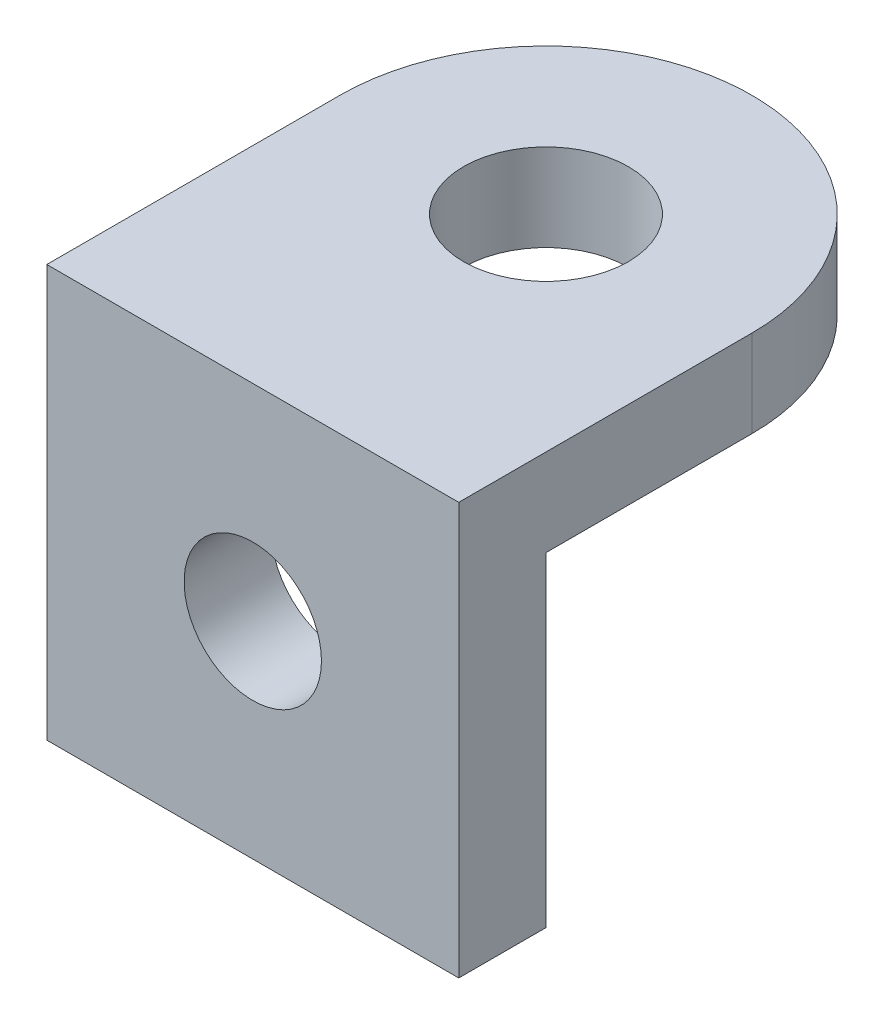
ISO-10303-21;
HEADER;
FILE_DESCRIPTION(('STEP AP214'),'2;1');
FILE_NAME('part.step','',(''),(''),'','','');
FILE_SCHEMA(('AUTOMOTIVE_DESIGN { 1 0 10303 214 1 1 1 1 }'));
ENDSEC;
DATA;
#1=APPLICATION_CONTEXT('core data for automotive mechanical design processes');
#2=APPLICATION_PROTOCOL_DEFINITION('international standard','automotive_design',2000,#1);
#3=PRODUCT_CONTEXT('',#1,'mechanical');
#4=PRODUCT('Part','Part','',(#3));
#5=PRODUCT_RELATED_PRODUCT_CATEGORY('part','',(#4));
#6=PRODUCT_DEFINITION_FORMATION('','',#4);
#7=PRODUCT_DEFINITION_CONTEXT('part definition',#1,'design');
#8=PRODUCT_DEFINITION('design','',#6,#7);
#9=PRODUCT_DEFINITION_SHAPE('','',#8);
#10=(LENGTH_UNIT() NAMED_UNIT(*) SI_UNIT(.MILLI.,.METRE.));
#11=(NAMED_UNIT(*) PLANE_ANGLE_UNIT() SI_UNIT($,.RADIAN.));
#12=(NAMED_UNIT(*) SI_UNIT($,.STERADIAN.) SOLID_ANGLE_UNIT());
#13=UNCERTAINTY_MEASURE_WITH_UNIT(LENGTH_MEASURE(1.E-05),#10,'distance_accuracy_value','');
#14=(GEOMETRIC_REPRESENTATION_CONTEXT(3) GLOBAL_UNCERTAINTY_ASSIGNED_CONTEXT((#13)) GLOBAL_UNIT_ASSIGNED_CONTEXT((#10,
#11,#12)) REPRESENTATION_CONTEXT('',''));
#15=CARTESIAN_POINT('',(0.,0.,0.));
#16=DIRECTION('',(0.,0.,1.));
#17=DIRECTION('',(1.,0.,0.));
#18=AXIS2_PLACEMENT_3D('',#15,#16,#17);
#19=CARTESIAN_POINT('',(0.,0.,3.175));
#20=DIRECTION('',(0.,0.,1.));
#21=DIRECTION('',(1.,0.,0.));
#22=AXIS2_PLACEMENT_3D('',#19,#20,#21);
#23=PLANE('',#22);
#24=DIRECTION('',(0.,1.,0.));
#25=VECTOR('',#24,1.);
#26=CARTESIAN_POINT('',(7.5,0.,3.175));
#27=LINE('',#26,#25);
#28=CARTESIAN_POINT('',(7.5,-15.,3.175));
#29=VERTEX_POINT('',#28);
#30=CARTESIAN_POINT('',(7.5,0.,3.175));
#31=VERTEX_POINT('',#30);
#32=EDGE_CURVE('E131',#29,#31,#27,.T.);
#33=ORIENTED_EDGE('',*,*,#32,.T.);
#34=DIRECTION('',(-1.,0.,0.));
#35=VECTOR('',#34,1.);
#36=CARTESIAN_POINT('',(-7.5,0.,3.175));
#37=LINE('',#36,#35);
#38=CARTESIAN_POINT('',(-7.5,0.,3.175));
#39=VERTEX_POINT('',#38);
#40=EDGE_CURVE('E79',#31,#39,#37,.T.);
#41=ORIENTED_EDGE('',*,*,#40,.T.);
#42=DIRECTION('',(0.,-1.,0.));
#43=VECTOR('',#42,1.);
#44=CARTESIAN_POINT('',(-7.5,0.,3.175));
#45=LINE('',#44,#43);
#46=CARTESIAN_POINT('',(-7.5,-15.,3.175));
#47=VERTEX_POINT('',#46);
#48=EDGE_CURVE('E134',#39,#47,#45,.T.);
#49=ORIENTED_EDGE('',*,*,#48,.T.);
#50=DIRECTION('',(1.,0.,0.));
#51=VECTOR('',#50,1.);
#52=CARTESIAN_POINT('',(-7.5,-15.,3.175));
#53=LINE('',#52,#51);
#54=EDGE_CURVE('E57',#47,#29,#53,.T.);
#55=ORIENTED_EDGE('',*,*,#54,.T.);
#56=EDGE_LOOP('',(#33,#41,#49,#55));
#57=FACE_BOUND('',#56,.T.);
#58=CARTESIAN_POINT('',(0.,-7.5,3.175));
#59=DIRECTION('',(0.,0.,1.));
#60=DIRECTION('',(1.,0.,0.));
#61=AXIS2_PLACEMENT_3D('',#58,#59,#60);
#62=CIRCLE('',#61,2.5);
#63=CARTESIAN_POINT('',(2.5,-7.5,3.175));
#64=VERTEX_POINT('',#63);
#65=EDGE_CURVE('E126',#64,#64,#62,.T.);
#66=ORIENTED_EDGE('',*,*,#65,.F.);
#67=EDGE_LOOP('',(#66));
#68=FACE_BOUND('',#67,.T.);
#69=ADVANCED_FACE('F33',(#57,#68),#23,.T.);
#70=CARTESIAN_POINT('',(0.,0.,0.));
#71=DIRECTION('',(0.,0.,1.));
#72=DIRECTION('',(1.,0.,0.));
#73=AXIS2_PLACEMENT_3D('',#70,#71,#72);
#74=PLANE('',#73);
#75=DIRECTION('',(0.,-1.,0.));
#76=VECTOR('',#75,1.);
#77=CARTESIAN_POINT('',(-7.5,0.,0.));
#78=LINE('',#77,#76);
#79=CARTESIAN_POINT('',(-7.5,-3.175,0.));
#80=VERTEX_POINT('',#79);
#81=CARTESIAN_POINT('',(-7.5,-15.,0.));
#82=VERTEX_POINT('',#81);
#83=EDGE_CURVE('E139',#80,#82,#78,.T.);
#84=ORIENTED_EDGE('',*,*,#83,.F.);
#85=DIRECTION('',(1.,0.,0.));
#86=VECTOR('',#85,1.);
#87=CARTESIAN_POINT('',(-7.5,-3.175,0.));
#88=LINE('',#87,#86);
#89=CARTESIAN_POINT('',(7.5,-3.175,0.));
#90=VERTEX_POINT('',#89);
#91=EDGE_CURVE('E106',#80,#90,#88,.T.);
#92=ORIENTED_EDGE('',*,*,#91,.T.);
#93=DIRECTION('',(0.,1.,0.));
#94=VECTOR('',#93,1.);
#95=CARTESIAN_POINT('',(7.5,0.,0.));
#96=LINE('',#95,#94);
#97=CARTESIAN_POINT('',(7.5,-15.,0.));
#98=VERTEX_POINT('',#97);
#99=EDGE_CURVE('E114',#98,#90,#96,.T.);
#100=ORIENTED_EDGE('',*,*,#99,.F.);
#101=DIRECTION('',(1.,0.,0.));
#102=VECTOR('',#101,1.);
#103=CARTESIAN_POINT('',(-7.5,-15.,0.));
#104=LINE('',#103,#102);
#105=EDGE_CURVE('E72',#82,#98,#104,.T.);
#106=ORIENTED_EDGE('',*,*,#105,.F.);
#107=EDGE_LOOP('',(#84,#92,#100,#106));
#108=FACE_BOUND('',#107,.T.);
#109=CARTESIAN_POINT('',(0.,-7.5,0.));
#110=DIRECTION('',(0.,0.,1.));
#111=DIRECTION('',(1.,0.,0.));
#112=AXIS2_PLACEMENT_3D('',#109,#110,#111);
#113=CIRCLE('',#112,2.5);
#114=CARTESIAN_POINT('',(2.5,-7.5,0.));
#115=VERTEX_POINT('',#114);
#116=EDGE_CURVE('E124',#115,#115,#113,.T.);
#117=ORIENTED_EDGE('',*,*,#116,.T.);
#118=EDGE_LOOP('',(#117));
#119=FACE_BOUND('',#118,.T.);
#120=ADVANCED_FACE('F166',(#108,#119),#74,.F.);
#121=CARTESIAN_POINT('',(7.5,0.,3.175));
#122=DIRECTION('',(-1.,0.,0.));
#123=DIRECTION('',(0.,0.,1.));
#124=AXIS2_PLACEMENT_3D('',#121,#122,#123);
#125=PLANE('',#124);
#126=ORIENTED_EDGE('',*,*,#99,.T.);
#127=DIRECTION('',(0.,0.,-1.));
#128=VECTOR('',#127,1.);
#129=CARTESIAN_POINT('',(7.5,-3.175,-7.5));
#130=LINE('',#129,#128);
#131=CARTESIAN_POINT('',(7.5,-3.175,-7.5));
#132=VERTEX_POINT('',#131);
#133=EDGE_CURVE('E48',#90,#132,#130,.T.);
#134=ORIENTED_EDGE('',*,*,#133,.T.);
#135=DIRECTION('',(0.,1.,0.));
#136=VECTOR('',#135,1.);
#137=CARTESIAN_POINT('',(7.5,-3.175,-7.5));
#138=LINE('',#137,#136);
#139=CARTESIAN_POINT('',(7.5,0.,-7.5));
#140=VERTEX_POINT('',#139);
#141=EDGE_CURVE('E97',#132,#140,#138,.T.);
#142=ORIENTED_EDGE('',*,*,#141,.T.);
#143=DIRECTION('',(0.,0.,-1.));
#144=VECTOR('',#143,1.);
#145=CARTESIAN_POINT('',(7.5,0.,3.175));
#146=LINE('',#145,#144);
#147=EDGE_CURVE('E11',#31,#140,#146,.T.);
#148=ORIENTED_EDGE('',*,*,#147,.F.);
#149=ORIENTED_EDGE('',*,*,#32,.F.);
#150=DIRECTION('',(0.,0.,-1.));
#151=VECTOR('',#150,1.);
#152=CARTESIAN_POINT('',(7.5,-15.,3.175));
#153=LINE('',#152,#151);
#154=EDGE_CURVE('E137',#29,#98,#153,.T.);
#155=ORIENTED_EDGE('',*,*,#154,.T.);
#156=EDGE_LOOP('',(#126,#134,#142,#148,#149,#155));
#157=FACE_BOUND('',#156,.T.);
#158=ADVANCED_FACE('F35',(#157),#125,.F.);
#159=CARTESIAN_POINT('',(-7.5,0.,3.175));
#160=DIRECTION('',(0.,-1.,0.));
#161=DIRECTION('',(0.,0.,-1.));
#162=AXIS2_PLACEMENT_3D('',#159,#160,#161);
#163=PLANE('',#162);
#164=ORIENTED_EDGE('',*,*,#147,.T.);
#165=CARTESIAN_POINT('',(0.,0.,-7.5));
#166=DIRECTION('',(0.,1.,0.));
#167=DIRECTION('',(0.,0.,1.));
#168=AXIS2_PLACEMENT_3D('',#165,#166,#167);
#169=CIRCLE('',#168,7.5);
#170=CARTESIAN_POINT('',(-7.5,0.,-7.5));
#171=VERTEX_POINT('',#170);
#172=EDGE_CURVE('E102',#140,#171,#169,.T.);
#173=ORIENTED_EDGE('',*,*,#172,.T.);
#174=DIRECTION('',(0.,0.,-1.));
#175=VECTOR('',#174,1.);
#176=CARTESIAN_POINT('',(-7.5,0.,3.175));
#177=LINE('',#176,#175);
#178=EDGE_CURVE('E41',#39,#171,#177,.T.);
#179=ORIENTED_EDGE('',*,*,#178,.F.);
#180=ORIENTED_EDGE('',*,*,#40,.F.);
#181=EDGE_LOOP('',(#164,#173,#179,#180));
#182=FACE_BOUND('',#181,.T.);
#183=CARTESIAN_POINT('',(0.,0.,-7.5));
#184=DIRECTION('',(0.,1.,0.));
#185=DIRECTION('',(0.,0.,1.));
#186=AXIS2_PLACEMENT_3D('',#183,#184,#185);
#187=CIRCLE('',#186,3.);
#188=CARTESIAN_POINT('',(0.,0.,-4.5));
#189=VERTEX_POINT('',#188);
#190=EDGE_CURVE('E119',#189,#189,#187,.T.);
#191=ORIENTED_EDGE('',*,*,#190,.F.);
#192=EDGE_LOOP('',(#191));
#193=FACE_BOUND('',#192,.T.);
#194=ADVANCED_FACE('F148',(#182,#193),#163,.F.);
#195=CARTESIAN_POINT('',(-7.5,0.,3.175));
#196=DIRECTION('',(1.,0.,0.));
#197=DIRECTION('',(0.,1.,0.));
#198=AXIS2_PLACEMENT_3D('',#195,#196,#197);
#199=PLANE('',#198);
#200=ORIENTED_EDGE('',*,*,#178,.T.);
#201=DIRECTION('',(0.,1.,0.));
#202=VECTOR('',#201,1.);
#203=CARTESIAN_POINT('',(-7.5,-3.175,-7.5));
#204=LINE('',#203,#202);
#205=CARTESIAN_POINT('',(-7.5,-3.175,-7.5));
#206=VERTEX_POINT('',#205);
#207=EDGE_CURVE('E105',#206,#171,#204,.T.);
#208=ORIENTED_EDGE('',*,*,#207,.F.);
#209=DIRECTION('',(0.,0.,1.));
#210=VECTOR('',#209,1.);
#211=CARTESIAN_POINT('',(-7.5,-3.175,-7.5));
#212=LINE('',#211,#210);
#213=EDGE_CURVE('E110',#206,#80,#212,.T.);
#214=ORIENTED_EDGE('',*,*,#213,.T.);
#215=ORIENTED_EDGE('',*,*,#83,.T.);
#216=DIRECTION('',(0.,0.,-1.));
#217=VECTOR('',#216,1.);
#218=CARTESIAN_POINT('',(-7.5,-15.,3.175));
#219=LINE('',#218,#217);
#220=EDGE_CURVE('E143',#47,#82,#219,.T.);
#221=ORIENTED_EDGE('',*,*,#220,.F.);
#222=ORIENTED_EDGE('',*,*,#48,.F.);
#223=EDGE_LOOP('',(#200,#208,#214,#215,#221,#222));
#224=FACE_BOUND('',#223,.T.);
#225=ADVANCED_FACE('F146',(#224),#199,.F.);
#226=CARTESIAN_POINT('',(-7.5,-15.,3.175));
#227=DIRECTION('',(0.,1.,0.));
#228=DIRECTION('',(-1.,0.,0.));
#229=AXIS2_PLACEMENT_3D('',#226,#227,#228);
#230=PLANE('',#229);
#231=ORIENTED_EDGE('',*,*,#105,.T.);
#232=ORIENTED_EDGE('',*,*,#154,.F.);
#233=ORIENTED_EDGE('',*,*,#54,.F.);
#234=ORIENTED_EDGE('',*,*,#220,.T.);
#235=EDGE_LOOP('',(#231,#232,#233,#234));
#236=FACE_BOUND('',#235,.T.);
#237=ADVANCED_FACE('F153',(#236),#230,.F.);
#238=CARTESIAN_POINT('',(0.,-7.5,3.175));
#239=DIRECTION('',(0.,0.,-1.));
#240=DIRECTION('',(-1.,0.,0.));
#241=AXIS2_PLACEMENT_3D('',#238,#239,#240);
#242=CYLINDRICAL_SURFACE('',#241,2.5);
#243=ORIENTED_EDGE('',*,*,#65,.T.);
#244=EDGE_LOOP('',(#243));
#245=FACE_BOUND('',#244,.T.);
#246=ORIENTED_EDGE('',*,*,#116,.F.);
#247=EDGE_LOOP('',(#246));
#248=FACE_BOUND('',#247,.T.);
#249=ADVANCED_FACE('F155',(#245,#248),#242,.F.);
#250=CARTESIAN_POINT('',(0.,-3.175,-7.5));
#251=DIRECTION('',(0.,1.,0.));
#252=DIRECTION('',(0.,0.,1.));
#253=AXIS2_PLACEMENT_3D('',#250,#251,#252);
#254=CYLINDRICAL_SURFACE('',#253,7.5);
#255=ORIENTED_EDGE('',*,*,#172,.F.);
#256=ORIENTED_EDGE('',*,*,#141,.F.);
#257=CARTESIAN_POINT('',(0.,-3.175,-7.5));
#258=DIRECTION('',(0.,1.,0.));
#259=DIRECTION('',(0.,0.,1.));
#260=AXIS2_PLACEMENT_3D('',#257,#258,#259);
#261=CIRCLE('',#260,7.5);
#262=EDGE_CURVE('E100',#132,#206,#261,.T.);
#263=ORIENTED_EDGE('',*,*,#262,.T.);
#264=ORIENTED_EDGE('',*,*,#207,.T.);
#265=EDGE_LOOP('',(#255,#256,#263,#264));
#266=FACE_BOUND('',#265,.T.);
#267=ADVANCED_FACE('F98',(#266),#254,.T.);
#268=CARTESIAN_POINT('',(0.,-3.175,-7.5));
#269=DIRECTION('',(0.,1.,0.));
#270=DIRECTION('',(0.,0.,1.));
#271=AXIS2_PLACEMENT_3D('',#268,#269,#270);
#272=PLANE('',#271);
#273=CARTESIAN_POINT('',(0.,-3.175,-7.5));
#274=DIRECTION('',(0.,1.,0.));
#275=DIRECTION('',(0.,0.,1.));
#276=AXIS2_PLACEMENT_3D('',#273,#274,#275);
#277=CIRCLE('',#276,3.);
#278=CARTESIAN_POINT('',(0.,-3.175,-4.5));
#279=VERTEX_POINT('',#278);
#280=EDGE_CURVE('E116',#279,#279,#277,.T.);
#281=ORIENTED_EDGE('',*,*,#280,.T.);
#282=EDGE_LOOP('',(#281));
#283=FACE_BOUND('',#282,.T.);
#284=ORIENTED_EDGE('',*,*,#133,.F.);
#285=ORIENTED_EDGE('',*,*,#91,.F.);
#286=ORIENTED_EDGE('',*,*,#213,.F.);
#287=ORIENTED_EDGE('',*,*,#262,.F.);
#288=EDGE_LOOP('',(#284,#285,#286,#287));
#289=FACE_BOUND('',#288,.T.);
#290=ADVANCED_FACE('F109',(#283,#289),#272,.F.);
#291=CARTESIAN_POINT('',(0.,-3.175,-7.5));
#292=DIRECTION('',(0.,1.,0.));
#293=DIRECTION('',(0.,0.,1.));
#294=AXIS2_PLACEMENT_3D('',#291,#292,#293);
#295=CYLINDRICAL_SURFACE('',#294,3.);
#296=ORIENTED_EDGE('',*,*,#280,.F.);
#297=EDGE_LOOP('',(#296));
#298=FACE_BOUND('',#297,.T.);
#299=ORIENTED_EDGE('',*,*,#190,.T.);
#300=EDGE_LOOP('',(#299));
#301=FACE_BOUND('',#300,.T.);
#302=ADVANCED_FACE('F177',(#298,#301),#295,.F.);
#303=CLOSED_SHELL('',(#69,#120,#158,#194,#225,#237,#249,#267,#290,#302));
#304=MANIFOLD_SOLID_BREP('B2',#303);
#305=ADVANCED_BREP_SHAPE_REPRESENTATION('',(#18,#304),#14);
#306=SHAPE_DEFINITION_REPRESENTATION(#9,#305);
ENDSEC;
END-ISO-10303-21;
